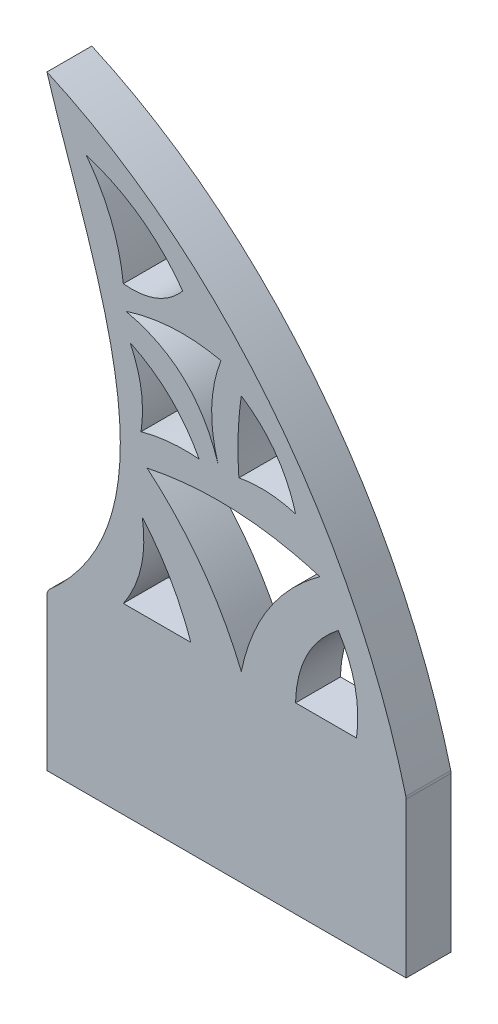
ISO-10303-21;
HEADER;
FILE_DESCRIPTION(('STEP AP214'),'2;1');
FILE_NAME('part.step','',(''),(''),'','','');
FILE_SCHEMA(('AUTOMOTIVE_DESIGN { 1 0 10303 214 1 1 1 1 }'));
ENDSEC;
DATA;
#1=APPLICATION_CONTEXT('core data for automotive mechanical design processes');
#2=APPLICATION_PROTOCOL_DEFINITION('international standard','automotive_design',2000,#1);
#3=PRODUCT_CONTEXT('',#1,'mechanical');
#4=PRODUCT('Part','Part','',(#3));
#5=PRODUCT_RELATED_PRODUCT_CATEGORY('part','',(#4));
#6=PRODUCT_DEFINITION_FORMATION('','',#4);
#7=PRODUCT_DEFINITION_CONTEXT('part definition',#1,'design');
#8=PRODUCT_DEFINITION('design','',#6,#7);
#9=PRODUCT_DEFINITION_SHAPE('','',#8);
#10=(LENGTH_UNIT() NAMED_UNIT(*) SI_UNIT(.MILLI.,.METRE.));
#11=(NAMED_UNIT(*) PLANE_ANGLE_UNIT() SI_UNIT($,.RADIAN.));
#12=(NAMED_UNIT(*) SI_UNIT($,.STERADIAN.) SOLID_ANGLE_UNIT());
#13=UNCERTAINTY_MEASURE_WITH_UNIT(LENGTH_MEASURE(1.E-05),#10,'distance_accuracy_value','');
#14=(GEOMETRIC_REPRESENTATION_CONTEXT(3) GLOBAL_UNCERTAINTY_ASSIGNED_CONTEXT((#13)) GLOBAL_UNIT_ASSIGNED_CONTEXT((#10,
#11,#12)) REPRESENTATION_CONTEXT('',''));
#15=CARTESIAN_POINT('',(0.,0.,0.));
#16=DIRECTION('',(0.,0.,1.));
#17=DIRECTION('',(1.,0.,0.));
#18=AXIS2_PLACEMENT_3D('',#15,#16,#17);
#19=CARTESIAN_POINT('',(0.,0.,12.7));
#20=DIRECTION('',(-1.,0.,0.));
#21=DIRECTION('',(0.,0.,1.));
#22=AXIS2_PLACEMENT_3D('',#19,#20,#21);
#23=PLANE('',#22);
#24=DIRECTION('',(0.,0.,1.));
#25=VECTOR('',#24,1.);
#26=CARTESIAN_POINT('',(0.,108.263964199217,0.));
#27=LINE('',#26,#25);
#28=CARTESIAN_POINT('',(0.,108.263964199217,0.));
#29=VERTEX_POINT('',#28);
#30=CARTESIAN_POINT('',(0.,108.263964199217,12.7));
#31=VERTEX_POINT('',#30);
#32=EDGE_CURVE('E63',#29,#31,#27,.T.);
#33=ORIENTED_EDGE('',*,*,#32,.T.);
#34=DIRECTION('',(0.,1.,0.));
#35=VECTOR('',#34,1.);
#36=CARTESIAN_POINT('',(0.,0.,12.7));
#37=LINE('',#36,#35);
#38=CARTESIAN_POINT('',(0.,151.251284081008,12.7));
#39=VERTEX_POINT('',#38);
#40=EDGE_CURVE('E70',#31,#39,#37,.T.);
#41=ORIENTED_EDGE('',*,*,#40,.T.);
#42=DIRECTION('',(0.,0.,-1.));
#43=VECTOR('',#42,1.);
#44=CARTESIAN_POINT('',(0.,151.251284081008,12.7));
#45=LINE('',#44,#43);
#46=CARTESIAN_POINT('',(0.,151.251284081008,0.));
#47=VERTEX_POINT('',#46);
#48=EDGE_CURVE('E56',#39,#47,#45,.T.);
#49=ORIENTED_EDGE('',*,*,#48,.T.);
#50=DIRECTION('',(0.,1.,0.));
#51=VECTOR('',#50,1.);
#52=CARTESIAN_POINT('',(0.,0.,0.));
#53=LINE('',#52,#51);
#54=EDGE_CURVE('E257',#29,#47,#53,.T.);
#55=ORIENTED_EDGE('',*,*,#54,.F.);
#56=EDGE_LOOP('',(#33,#41,#49,#55));
#57=FACE_BOUND('',#56,.T.);
#58=ADVANCED_FACE('F47',(#57),#23,.T.);
#59=CARTESIAN_POINT('',(101.6,0.,12.7));
#60=DIRECTION('',(-1.,0.,0.));
#61=DIRECTION('',(0.,0.,1.));
#62=AXIS2_PLACEMENT_3D('',#59,#60,#61);
#63=PLANE('',#62);
#64=DIRECTION('',(0.,1.,0.));
#65=VECTOR('',#64,1.);
#66=CARTESIAN_POINT('',(101.6,0.,12.7));
#67=LINE('',#66,#65);
#68=CARTESIAN_POINT('',(101.6,108.263964199217,12.7));
#69=VERTEX_POINT('',#68);
#70=CARTESIAN_POINT('',(101.6,152.077820816032,12.7));
#71=VERTEX_POINT('',#70);
#72=EDGE_CURVE('E247',#69,#71,#67,.T.);
#73=ORIENTED_EDGE('',*,*,#72,.F.);
#74=DIRECTION('',(0.,0.,1.));
#75=VECTOR('',#74,1.);
#76=CARTESIAN_POINT('',(101.6,108.263964199217,0.));
#77=LINE('',#76,#75);
#78=CARTESIAN_POINT('',(101.6,108.263964199217,0.));
#79=VERTEX_POINT('',#78);
#80=EDGE_CURVE('E233',#79,#69,#77,.T.);
#81=ORIENTED_EDGE('',*,*,#80,.F.);
#82=DIRECTION('',(0.,1.,0.));
#83=VECTOR('',#82,1.);
#84=CARTESIAN_POINT('',(101.6,0.,0.));
#85=LINE('',#84,#83);
#86=CARTESIAN_POINT('',(101.6,152.077820816032,0.));
#87=VERTEX_POINT('',#86);
#88=EDGE_CURVE('E245',#79,#87,#85,.T.);
#89=ORIENTED_EDGE('',*,*,#88,.T.);
#90=DIRECTION('',(0.,0.,1.));
#91=VECTOR('',#90,1.);
#92=CARTESIAN_POINT('',(101.6,152.077820816032,12.7));
#93=LINE('',#92,#91);
#94=EDGE_CURVE('E278',#87,#71,#93,.T.);
#95=ORIENTED_EDGE('',*,*,#94,.T.);
#96=EDGE_LOOP('',(#73,#81,#89,#95));
#97=FACE_BOUND('',#96,.T.);
#98=ADVANCED_FACE('F243',(#97),#63,.F.);
#99=CARTESIAN_POINT('',(0.,0.,12.7));
#100=DIRECTION('',(0.,0.,1.));
#101=DIRECTION('',(1.,0.,0.));
#102=AXIS2_PLACEMENT_3D('',#99,#100,#101);
#103=PLANE('',#102);
#104=DIRECTION('',(-1.,0.,0.));
#105=VECTOR('',#104,1.);
#106=CARTESIAN_POINT('',(101.519048921032,108.263964199217,12.7));
#107=LINE('',#106,#105);
#108=EDGE_CURVE('E239',#69,#31,#107,.T.);
#109=ORIENTED_EDGE('',*,*,#108,.F.);
#110=ORIENTED_EDGE('',*,*,#72,.T.);
#111=CARTESIAN_POINT('',(99.06,152.077820816032,12.7));
#112=DIRECTION('',(0.,0.,1.));
#113=DIRECTION('',(1.,0.,0.));
#114=AXIS2_PLACEMENT_3D('',#111,#112,#113);
#115=CIRCLE('',#114,2.54);
#116=CARTESIAN_POINT('',(101.519048921032,152.713964199217,12.7));
#117=VERTEX_POINT('',#116);
#118=EDGE_CURVE('E284',#71,#117,#115,.T.);
#119=ORIENTED_EDGE('',*,*,#118,.T.);
#120=CARTESIAN_POINT('',(0.,279.4,12.7));
#121=CARTESIAN_POINT('',(51.286050257495,256.550041835225,12.7));
#122=CARTESIAN_POINT('',(87.8368923823486,205.957944637487,12.7));
#123=CARTESIAN_POINT('',(101.6,152.4,12.7));
#124=B_SPLINE_CURVE_WITH_KNOTS('',3,(#120,#121,#122,#123),.UNSPECIFIED.,.F.,.F.,(4,4),(0.,1.),.UNSPECIFIED.);
#125=CARTESIAN_POINT('',(0.,279.4,12.7));
#126=VERTEX_POINT('',#125);
#127=EDGE_CURVE('E504',#126,#117,#124,.T.);
#128=ORIENTED_EDGE('',*,*,#127,.F.);
#129=CARTESIAN_POINT('',(0.,152.4,12.7));
#130=CARTESIAN_POINT('',(39.7901112765311,186.839065643264,12.7));
#131=CARTESIAN_POINT('',(12.3097562496038,238.845497072906,12.7));
#132=CARTESIAN_POINT('',(0.,279.4,12.7));
#133=B_SPLINE_CURVE_WITH_KNOTS('',3,(#129,#130,#131,#132),.UNSPECIFIED.,.F.,.F.,(4,4),(0.,1.),.UNSPECIFIED.);
#134=CARTESIAN_POINT('',(0.847696562527861,153.145408964832,12.7));
#135=VERTEX_POINT('',#134);
#136=EDGE_CURVE('E507',#135,#126,#133,.T.);
#137=ORIENTED_EDGE('',*,*,#136,.F.);
#138=CARTESIAN_POINT('',(2.54,151.251284081008,12.7));
#139=DIRECTION('',(0.,0.,1.));
#140=DIRECTION('',(1.,0.,0.));
#141=AXIS2_PLACEMENT_3D('',#138,#139,#140);
#142=CIRCLE('',#141,2.54);
#143=EDGE_CURVE('E281',#135,#39,#142,.T.);
#144=ORIENTED_EDGE('',*,*,#143,.T.);
#145=ORIENTED_EDGE('',*,*,#40,.F.);
#146=EDGE_LOOP('',(#109,#110,#119,#128,#137,#144,#145));
#147=FACE_BOUND('',#146,.T.);
#148=CARTESIAN_POINT('',(49.2258384870738,233.315766273676,12.7));
#149=CARTESIAN_POINT('',(35.6412289440212,236.267866948693,12.7));
#150=CARTESIAN_POINT('',(22.3756152670284,231.937259722309,12.7));
#151=B_SPLINE_CURVE_WITH_KNOTS('',2,(#148,#149,#150),.UNSPECIFIED.,.F.,.F.,(3,3),(0.,1.),.UNSPECIFIED.);
#152=CARTESIAN_POINT('',(49.2258384870738,233.315766273676,12.7));
#153=VERTEX_POINT('',#152);
#154=CARTESIAN_POINT('',(22.3756152670284,231.937259722309,12.7));
#155=VERTEX_POINT('',#154);
#156=EDGE_CURVE('E421',#153,#155,#151,.T.);
#157=ORIENTED_EDGE('',*,*,#156,.F.);
#158=CARTESIAN_POINT('',(48.4003507205885,207.535437600744,12.7));
#159=CARTESIAN_POINT('',(44.3935689433076,220.734513873405,12.7));
#160=CARTESIAN_POINT('',(49.2258384870738,233.315766273676,12.7));
#161=B_SPLINE_CURVE_WITH_KNOTS('',2,(#158,#159,#160),.UNSPECIFIED.,.F.,.F.,(3,3),(0.,1.),.UNSPECIFIED.);
#162=CARTESIAN_POINT('',(48.4003507205885,207.535437600744,12.7));
#163=VERTEX_POINT('',#162);
#164=EDGE_CURVE('E1028',#163,#153,#161,.T.);
#165=ORIENTED_EDGE('',*,*,#164,.F.);
#166=CARTESIAN_POINT('',(48.4003507205885,207.535437600744,12.7));
#167=CARTESIAN_POINT('',(42.0541709012612,227.566198030611,12.7));
#168=CARTESIAN_POINT('',(22.3756152670284,231.937259722309,12.7));
#169=B_SPLINE_CURVE_WITH_KNOTS('',2,(#166,#167,#168),.UNSPECIFIED.,.F.,.F.,(3,3),(0.,1.),.UNSPECIFIED.);
#170=EDGE_CURVE('E1022',#163,#155,#169,.T.);
#171=ORIENTED_EDGE('',*,*,#170,.T.);
#172=EDGE_LOOP('',(#157,#165,#171));
#173=FACE_BOUND('',#172,.T.);
#174=CARTESIAN_POINT('',(43.0534809797926,206.088034939823,12.7));
#175=CARTESIAN_POINT('',(36.2397899942018,218.912660539888,12.7));
#176=CARTESIAN_POINT('',(23.5160663721444,224.861937296205,12.7));
#177=B_SPLINE_CURVE_WITH_KNOTS('',2,(#174,#175,#176),.UNSPECIFIED.,.F.,.F.,(3,3),(0.,1.),.UNSPECIFIED.);
#178=CARTESIAN_POINT('',(43.0534809797926,206.088034939823,12.7));
#179=VERTEX_POINT('',#178);
#180=CARTESIAN_POINT('',(23.5160663721444,224.861937296205,12.7));
#181=VERTEX_POINT('',#180);
#182=EDGE_CURVE('E1027',#179,#181,#177,.T.);
#183=ORIENTED_EDGE('',*,*,#182,.F.);
#184=CARTESIAN_POINT('',(26.6057281170054,204.582177714214,12.7));
#185=CARTESIAN_POINT('',(34.7004326090841,206.792891753804,12.7));
#186=CARTESIAN_POINT('',(43.0534809797926,206.088034939823,12.7));
#187=B_SPLINE_CURVE_WITH_KNOTS('',2,(#184,#185,#186),.UNSPECIFIED.,.F.,.F.,(3,3),(0.,1.),.UNSPECIFIED.);
#188=CARTESIAN_POINT('',(26.6057281170054,204.582177714214,12.7));
#189=VERTEX_POINT('',#188);
#190=EDGE_CURVE('E1042',#189,#179,#187,.T.);
#191=ORIENTED_EDGE('',*,*,#190,.F.);
#192=CARTESIAN_POINT('',(23.5160663721444,224.861937296205,12.7));
#193=CARTESIAN_POINT('',(28.2352954071151,215.219272619894,12.7));
#194=CARTESIAN_POINT('',(26.6057281170054,204.582177714214,12.7));
#195=B_SPLINE_CURVE_WITH_KNOTS('',2,(#192,#193,#194),.UNSPECIFIED.,.F.,.F.,(3,3),(0.,1.),.UNSPECIFIED.);
#196=EDGE_CURVE('E1051',#181,#189,#195,.T.);
#197=ORIENTED_EDGE('',*,*,#196,.F.);
#198=EDGE_LOOP('',(#183,#191,#197));
#199=FACE_BOUND('',#198,.T.);
#200=CARTESIAN_POINT('',(82.3960896551855,183.8137177803,12.7));
#201=CARTESIAN_POINT('',(70.6713648996861,174.663598783607,12.7));
#202=CARTESIAN_POINT('',(70.3277731701593,160.02,12.7));
#203=B_SPLINE_CURVE_WITH_KNOTS('',2,(#200,#201,#202),.UNSPECIFIED.,.F.,.F.,(3,3),(0.,1.),.UNSPECIFIED.);
#204=CARTESIAN_POINT('',(82.3960896551855,183.8137177803,12.7));
#205=VERTEX_POINT('',#204);
#206=CARTESIAN_POINT('',(70.3277731701593,160.02,12.7));
#207=VERTEX_POINT('',#206);
#208=EDGE_CURVE('E559',#205,#207,#203,.T.);
#209=ORIENTED_EDGE('',*,*,#208,.F.);
#210=CARTESIAN_POINT('',(82.3960896551855,183.8137177803,12.7));
#211=CARTESIAN_POINT('',(89.3395503674179,172.773814042826,12.7));
#212=CARTESIAN_POINT('',(87.546521436446,160.02,12.7));
#213=B_SPLINE_CURVE_WITH_KNOTS('',2,(#210,#211,#212),.UNSPECIFIED.,.F.,.F.,(3,3),(0.,1.),.UNSPECIFIED.);
#214=CARTESIAN_POINT('',(87.546521436446,160.02,12.7));
#215=VERTEX_POINT('',#214);
#216=EDGE_CURVE('E554',#205,#215,#213,.T.);
#217=ORIENTED_EDGE('',*,*,#216,.T.);
#218=DIRECTION('',(1.,0.,0.));
#219=VECTOR('',#218,1.);
#220=CARTESIAN_POINT('',(0.,160.02,12.7));
#221=LINE('',#220,#219);
#222=EDGE_CURVE('E514',#207,#215,#221,.T.);
#223=ORIENTED_EDGE('',*,*,#222,.F.);
#224=EDGE_LOOP('',(#209,#217,#223));
#225=FACE_BOUND('',#224,.T.);
#226=CARTESIAN_POINT('',(26.9804663757679,183.813742110307,12.7));
#227=CARTESIAN_POINT('',(28.9587756049128,170.83754360767,12.7));
#228=CARTESIAN_POINT('',(21.602944742717,160.02,12.7));
#229=B_SPLINE_CURVE_WITH_KNOTS('',2,(#226,#227,#228),.UNSPECIFIED.,.F.,.F.,(3,3),(0.,1.),.UNSPECIFIED.);
#230=CARTESIAN_POINT('',(26.9804663757679,183.813742110307,12.7));
#231=VERTEX_POINT('',#230);
#232=CARTESIAN_POINT('',(21.602944742717,160.02,12.7));
#233=VERTEX_POINT('',#232);
#234=EDGE_CURVE('E506',#231,#233,#229,.T.);
#235=ORIENTED_EDGE('',*,*,#234,.F.);
#236=CARTESIAN_POINT('',(26.9804663757679,183.813742110307,12.7));
#237=CARTESIAN_POINT('',(36.1384728498924,173.175056715144,12.7));
#238=CARTESIAN_POINT('',(40.6766417755855,160.02,12.7));
#239=B_SPLINE_CURVE_WITH_KNOTS('',2,(#236,#237,#238),.UNSPECIFIED.,.F.,.F.,(3,3),(0.,1.),.UNSPECIFIED.);
#240=CARTESIAN_POINT('',(40.6766417755855,160.02,12.7));
#241=VERTEX_POINT('',#240);
#242=EDGE_CURVE('E512',#231,#241,#239,.T.);
#243=ORIENTED_EDGE('',*,*,#242,.T.);
#244=DIRECTION('',(-1.,0.,0.));
#245=VECTOR('',#244,1.);
#246=CARTESIAN_POINT('',(0.,160.02,12.7));
#247=LINE('',#246,#245);
#248=EDGE_CURVE('E757',#241,#233,#247,.T.);
#249=ORIENTED_EDGE('',*,*,#248,.T.);
#250=EDGE_LOOP('',(#235,#243,#249));
#251=FACE_BOUND('',#250,.T.);
#252=CARTESIAN_POINT('',(54.9770830803954,160.02,12.7));
#253=CARTESIAN_POINT('',(46.0834758399413,181.547553160455,12.7));
#254=CARTESIAN_POINT('',(28.3421369029203,196.52980248231,12.7));
#255=B_SPLINE_CURVE_WITH_KNOTS('',2,(#252,#253,#254),.UNSPECIFIED.,.F.,.F.,(3,3),(0.,1.),.UNSPECIFIED.);
#256=CARTESIAN_POINT('',(54.9770830803954,160.02,12.7));
#257=VERTEX_POINT('',#256);
#258=CARTESIAN_POINT('',(28.3421369029203,196.52980248231,12.7));
#259=VERTEX_POINT('',#258);
#260=EDGE_CURVE('E747',#257,#259,#255,.T.);
#261=ORIENTED_EDGE('',*,*,#260,.T.);
#262=CARTESIAN_POINT('',(28.3421369029203,196.52980248231,12.7));
#263=CARTESIAN_POINT('',(53.0178150021792,201.732288520624,12.7));
#264=CARTESIAN_POINT('',(77.1872044953657,194.363538627742,12.7));
#265=B_SPLINE_CURVE_WITH_KNOTS('',2,(#262,#263,#264),.UNSPECIFIED.,.F.,.F.,(3,3),(0.,1.),.UNSPECIFIED.);
#266=CARTESIAN_POINT('',(77.1872044953657,194.363538627742,12.7));
#267=VERTEX_POINT('',#266);
#268=EDGE_CURVE('E738',#259,#267,#265,.T.);
#269=ORIENTED_EDGE('',*,*,#268,.T.);
#270=CARTESIAN_POINT('',(54.9770830803954,160.02,12.7));
#271=CARTESIAN_POINT('',(59.3747288950181,181.400643158016,12.7));
#272=CARTESIAN_POINT('',(77.1872044953657,194.363538627742,12.7));
#273=B_SPLINE_CURVE_WITH_KNOTS('',2,(#270,#271,#272),.UNSPECIFIED.,.F.,.F.,(3,3),(0.,1.),.UNSPECIFIED.);
#274=EDGE_CURVE('E732',#257,#267,#273,.T.);
#275=ORIENTED_EDGE('',*,*,#274,.F.);
#276=EDGE_LOOP('',(#261,#269,#275));
#277=FACE_BOUND('',#276,.T.);
#278=CARTESIAN_POINT('',(70.3282595613759,206.27745757837,12.7));
#279=CARTESIAN_POINT('',(62.3615769619994,208.669014940846,12.7));
#280=CARTESIAN_POINT('',(54.287141361752,207.109917469007,12.7));
#281=B_SPLINE_CURVE_WITH_KNOTS('',2,(#278,#279,#280),.UNSPECIFIED.,.F.,.F.,(3,3),(0.,1.),.UNSPECIFIED.);
#282=CARTESIAN_POINT('',(70.3282595613759,206.27745757837,12.7));
#283=VERTEX_POINT('',#282);
#284=CARTESIAN_POINT('',(54.287141361752,207.109917469007,12.7));
#285=VERTEX_POINT('',#284);
#286=EDGE_CURVE('E709',#283,#285,#281,.T.);
#287=ORIENTED_EDGE('',*,*,#286,.T.);
#288=CARTESIAN_POINT('',(54.287141361752,207.109917469007,12.7));
#289=CARTESIAN_POINT('',(53.4820968113887,217.391663166995,12.7));
#290=CARTESIAN_POINT('',(54.9770830803954,227.557269011986,12.7));
#291=B_SPLINE_CURVE_WITH_KNOTS('',2,(#288,#289,#290),.UNSPECIFIED.,.F.,.F.,(3,3),(0.,1.),.UNSPECIFIED.);
#292=CARTESIAN_POINT('',(54.9770830803954,227.557269011986,12.7));
#293=VERTEX_POINT('',#292);
#294=EDGE_CURVE('E700',#285,#293,#291,.T.);
#295=ORIENTED_EDGE('',*,*,#294,.T.);
#296=CARTESIAN_POINT('',(54.9770830803954,227.557269011986,12.7));
#297=CARTESIAN_POINT('',(66.6458597542174,219.852180833507,12.7));
#298=CARTESIAN_POINT('',(70.3282595613759,206.27745757837,12.7));
#299=B_SPLINE_CURVE_WITH_KNOTS('',2,(#296,#297,#298),.UNSPECIFIED.,.F.,.F.,(3,3),(0.,1.),.UNSPECIFIED.);
#300=EDGE_CURVE('E691',#293,#283,#299,.T.);
#301=ORIENTED_EDGE('',*,*,#300,.T.);
#302=EDGE_LOOP('',(#287,#295,#301));
#303=FACE_BOUND('',#302,.T.);
#304=CARTESIAN_POINT('',(21.602944742717,238.323137826184,12.7));
#305=CARTESIAN_POINT('',(19.9519756703058,252.974545224531,12.7));
#306=CARTESIAN_POINT('',(11.0947377675254,264.601494060694,12.7));
#307=B_SPLINE_CURVE_WITH_KNOTS('',2,(#304,#305,#306),.UNSPECIFIED.,.F.,.F.,(3,3),(0.,1.),.UNSPECIFIED.);
#308=CARTESIAN_POINT('',(21.602944742717,238.323137826184,12.7));
#309=VERTEX_POINT('',#308);
#310=CARTESIAN_POINT('',(11.0947377675254,264.601494060694,12.7));
#311=VERTEX_POINT('',#310);
#312=EDGE_CURVE('E685',#309,#311,#307,.T.);
#313=ORIENTED_EDGE('',*,*,#312,.T.);
#314=CARTESIAN_POINT('',(11.0947377675254,264.601494060694,12.7));
#315=CARTESIAN_POINT('',(28.0538351864922,259.295838114787,12.7));
#316=CARTESIAN_POINT('',(38.4122672823243,244.949944055659,12.7));
#317=B_SPLINE_CURVE_WITH_KNOTS('',2,(#314,#315,#316),.UNSPECIFIED.,.F.,.F.,(3,3),(0.,1.),.UNSPECIFIED.);
#318=CARTESIAN_POINT('',(38.4122672823243,244.949944055659,12.7));
#319=VERTEX_POINT('',#318);
#320=EDGE_CURVE('E658',#311,#319,#317,.T.);
#321=ORIENTED_EDGE('',*,*,#320,.T.);
#322=CARTESIAN_POINT('',(21.602944742717,238.323137826184,12.7));
#323=CARTESIAN_POINT('',(31.864782778685,237.284469605231,12.7));
#324=CARTESIAN_POINT('',(38.4122672823243,244.949944055659,12.7));
#325=B_SPLINE_CURVE_WITH_KNOTS('',2,(#322,#323,#324),.UNSPECIFIED.,.F.,.F.,(3,3),(0.,1.),.UNSPECIFIED.);
#326=EDGE_CURVE('E487',#309,#319,#325,.T.);
#327=ORIENTED_EDGE('',*,*,#326,.F.);
#328=EDGE_LOOP('',(#313,#321,#327));
#329=FACE_BOUND('',#328,.T.);
#330=ADVANCED_FACE('F494',(#147,#173,#199,#225,#251,#277,#303,#329),#103,.T.);
#331=CARTESIAN_POINT('',(0.,0.,0.));
#332=DIRECTION('',(0.,0.,1.));
#333=DIRECTION('',(1.,0.,0.));
#334=AXIS2_PLACEMENT_3D('',#331,#332,#333);
#335=PLANE('',#334);
#336=ORIENTED_EDGE('',*,*,#88,.F.);
#337=DIRECTION('',(-1.,0.,0.));
#338=VECTOR('',#337,1.);
#339=CARTESIAN_POINT('',(101.519048921032,108.263964199217,0.));
#340=LINE('',#339,#338);
#341=EDGE_CURVE('E230',#79,#29,#340,.T.);
#342=ORIENTED_EDGE('',*,*,#341,.T.);
#343=ORIENTED_EDGE('',*,*,#54,.T.);
#344=CARTESIAN_POINT('',(2.54,151.251284081008,0.));
#345=DIRECTION('',(0.,0.,1.));
#346=DIRECTION('',(1.,0.,0.));
#347=AXIS2_PLACEMENT_3D('',#344,#345,#346);
#348=CIRCLE('',#347,2.54);
#349=CARTESIAN_POINT('',(0.847696562527882,153.145408964832,0.));
#350=VERTEX_POINT('',#349);
#351=EDGE_CURVE('E273',#47,#350,#348,.F.);
#352=ORIENTED_EDGE('',*,*,#351,.T.);
#353=CARTESIAN_POINT('',(0.,152.4,0.));
#354=CARTESIAN_POINT('',(39.7901112765311,186.839065643264,0.));
#355=CARTESIAN_POINT('',(12.3097562496038,238.845497072906,0.));
#356=CARTESIAN_POINT('',(0.,279.4,0.));
#357=B_SPLINE_CURVE_WITH_KNOTS('',3,(#353,#354,#355,#356),.UNSPECIFIED.,.F.,.F.,(4,4),(0.,1.),.UNSPECIFIED.);
#358=CARTESIAN_POINT('',(0.,279.4,0.));
#359=VERTEX_POINT('',#358);
#360=EDGE_CURVE('E293',#350,#359,#357,.T.);
#361=ORIENTED_EDGE('',*,*,#360,.T.);
#362=CARTESIAN_POINT('',(0.,279.4,0.));
#363=CARTESIAN_POINT('',(51.286050257495,256.550041835225,0.));
#364=CARTESIAN_POINT('',(87.8368923823486,205.957944637487,0.));
#365=CARTESIAN_POINT('',(101.6,152.4,0.));
#366=B_SPLINE_CURVE_WITH_KNOTS('',3,(#362,#363,#364,#365),.UNSPECIFIED.,.F.,.F.,(4,4),(0.,1.),.UNSPECIFIED.);
#367=CARTESIAN_POINT('',(101.519048921032,152.713964199217,0.));
#368=VERTEX_POINT('',#367);
#369=EDGE_CURVE('E302',#359,#368,#366,.T.);
#370=ORIENTED_EDGE('',*,*,#369,.T.);
#371=CARTESIAN_POINT('',(99.06,152.077820816032,0.));
#372=DIRECTION('',(0.,0.,1.));
#373=DIRECTION('',(1.,0.,0.));
#374=AXIS2_PLACEMENT_3D('',#371,#372,#373);
#375=CIRCLE('',#374,2.54);
#376=EDGE_CURVE('E254',#368,#87,#375,.F.);
#377=ORIENTED_EDGE('',*,*,#376,.T.);
#378=EDGE_LOOP('',(#336,#342,#343,#352,#361,#370,#377));
#379=FACE_BOUND('',#378,.T.);
#380=CARTESIAN_POINT('',(49.2258384870738,233.315766273676,0.));
#381=CARTESIAN_POINT('',(35.6412289440212,236.267866948693,0.));
#382=CARTESIAN_POINT('',(22.3756152670284,231.937259722309,0.));
#383=B_SPLINE_CURVE_WITH_KNOTS('',2,(#380,#381,#382),.UNSPECIFIED.,.F.,.F.,(3,3),(0.,1.),.UNSPECIFIED.);
#384=CARTESIAN_POINT('',(49.2258384870738,233.315766273676,0.));
#385=VERTEX_POINT('',#384);
#386=CARTESIAN_POINT('',(22.3756152670284,231.937259722309,0.));
#387=VERTEX_POINT('',#386);
#388=EDGE_CURVE('E249',#385,#387,#383,.T.);
#389=ORIENTED_EDGE('',*,*,#388,.T.);
#390=CARTESIAN_POINT('',(48.4003507205885,207.535437600744,0.));
#391=CARTESIAN_POINT('',(42.0541709012612,227.566198030611,0.));
#392=CARTESIAN_POINT('',(22.3756152670284,231.937259722309,0.));
#393=B_SPLINE_CURVE_WITH_KNOTS('',2,(#390,#391,#392),.UNSPECIFIED.,.F.,.F.,(3,3),(0.,1.),.UNSPECIFIED.);
#394=CARTESIAN_POINT('',(48.4003507205885,207.535437600744,0.));
#395=VERTEX_POINT('',#394);
#396=EDGE_CURVE('E623',#395,#387,#393,.T.);
#397=ORIENTED_EDGE('',*,*,#396,.F.);
#398=CARTESIAN_POINT('',(48.4003507205885,207.535437600744,0.));
#399=CARTESIAN_POINT('',(44.3935689433076,220.734513873405,0.));
#400=CARTESIAN_POINT('',(49.2258384870738,233.315766273676,0.));
#401=B_SPLINE_CURVE_WITH_KNOTS('',2,(#398,#399,#400),.UNSPECIFIED.,.F.,.F.,(3,3),(0.,1.),.UNSPECIFIED.);
#402=EDGE_CURVE('E632',#395,#385,#401,.T.);
#403=ORIENTED_EDGE('',*,*,#402,.T.);
#404=EDGE_LOOP('',(#389,#397,#403));
#405=FACE_BOUND('',#404,.T.);
#406=CARTESIAN_POINT('',(43.0534809797926,206.088034939823,0.));
#407=CARTESIAN_POINT('',(36.2397899942018,218.912660539888,0.));
#408=CARTESIAN_POINT('',(23.5160663721444,224.861937296205,0.));
#409=B_SPLINE_CURVE_WITH_KNOTS('',2,(#406,#407,#408),.UNSPECIFIED.,.F.,.F.,(3,3),(0.,1.),.UNSPECIFIED.);
#410=CARTESIAN_POINT('',(43.0534809797926,206.088034939823,0.));
#411=VERTEX_POINT('',#410);
#412=CARTESIAN_POINT('',(23.5160663721444,224.861937296205,0.));
#413=VERTEX_POINT('',#412);
#414=EDGE_CURVE('E614',#411,#413,#409,.T.);
#415=ORIENTED_EDGE('',*,*,#414,.T.);
#416=CARTESIAN_POINT('',(23.5160663721444,224.861937296205,0.));
#417=CARTESIAN_POINT('',(28.2352954071151,215.219272619894,0.));
#418=CARTESIAN_POINT('',(26.6057281170054,204.582177714214,0.));
#419=B_SPLINE_CURVE_WITH_KNOTS('',2,(#416,#417,#418),.UNSPECIFIED.,.F.,.F.,(3,3),(0.,1.),.UNSPECIFIED.);
#420=CARTESIAN_POINT('',(26.6057281170054,204.582177714214,0.));
#421=VERTEX_POINT('',#420);
#422=EDGE_CURVE('E587',#413,#421,#419,.T.);
#423=ORIENTED_EDGE('',*,*,#422,.T.);
#424=CARTESIAN_POINT('',(26.6057281170054,204.582177714214,0.));
#425=CARTESIAN_POINT('',(34.7004326090841,206.792891753804,0.));
#426=CARTESIAN_POINT('',(43.0534809797926,206.088034939823,0.));
#427=B_SPLINE_CURVE_WITH_KNOTS('',2,(#424,#425,#426),.UNSPECIFIED.,.F.,.F.,(3,3),(0.,1.),.UNSPECIFIED.);
#428=EDGE_CURVE('E591',#421,#411,#427,.T.);
#429=ORIENTED_EDGE('',*,*,#428,.T.);
#430=EDGE_LOOP('',(#415,#423,#429));
#431=FACE_BOUND('',#430,.T.);
#432=CARTESIAN_POINT('',(82.3960896551855,183.8137177803,0.));
#433=CARTESIAN_POINT('',(70.6713648996861,174.663598783607,0.));
#434=CARTESIAN_POINT('',(70.3277731701593,160.02,0.));
#435=B_SPLINE_CURVE_WITH_KNOTS('',2,(#432,#433,#434),.UNSPECIFIED.,.F.,.F.,(3,3),(0.,1.),.UNSPECIFIED.);
#436=CARTESIAN_POINT('',(82.3960896551855,183.8137177803,0.));
#437=VERTEX_POINT('',#436);
#438=CARTESIAN_POINT('',(70.3277731701593,160.02,0.));
#439=VERTEX_POINT('',#438);
#440=EDGE_CURVE('E583',#437,#439,#435,.T.);
#441=ORIENTED_EDGE('',*,*,#440,.T.);
#442=DIRECTION('',(1.,0.,0.));
#443=VECTOR('',#442,1.);
#444=CARTESIAN_POINT('',(0.,160.02,0.));
#445=LINE('',#444,#443);
#446=CARTESIAN_POINT('',(87.546521436446,160.02,0.));
#447=VERTEX_POINT('',#446);
#448=EDGE_CURVE('E303',#439,#447,#445,.T.);
#449=ORIENTED_EDGE('',*,*,#448,.T.);
#450=CARTESIAN_POINT('',(82.3960896551855,183.8137177803,0.));
#451=CARTESIAN_POINT('',(89.3395503674179,172.773814042826,0.));
#452=CARTESIAN_POINT('',(87.546521436446,160.02,0.));
#453=B_SPLINE_CURVE_WITH_KNOTS('',2,(#450,#451,#452),.UNSPECIFIED.,.F.,.F.,(3,3),(0.,1.),.UNSPECIFIED.);
#454=EDGE_CURVE('E310',#437,#447,#453,.T.);
#455=ORIENTED_EDGE('',*,*,#454,.F.);
#456=EDGE_LOOP('',(#441,#449,#455));
#457=FACE_BOUND('',#456,.T.);
#458=CARTESIAN_POINT('',(26.9804663757679,183.813742110307,0.));
#459=CARTESIAN_POINT('',(28.9587756049128,170.83754360767,0.));
#460=CARTESIAN_POINT('',(21.602944742717,160.02,0.));
#461=B_SPLINE_CURVE_WITH_KNOTS('',2,(#458,#459,#460),.UNSPECIFIED.,.F.,.F.,(3,3),(0.,1.),.UNSPECIFIED.);
#462=CARTESIAN_POINT('',(26.9804663757679,183.813742110307,0.));
#463=VERTEX_POINT('',#462);
#464=CARTESIAN_POINT('',(21.602944742717,160.02,0.));
#465=VERTEX_POINT('',#464);
#466=EDGE_CURVE('E307',#463,#465,#461,.T.);
#467=ORIENTED_EDGE('',*,*,#466,.T.);
#468=DIRECTION('',(-1.,0.,0.));
#469=VECTOR('',#468,1.);
#470=CARTESIAN_POINT('',(0.,160.02,0.));
#471=LINE('',#470,#469);
#472=CARTESIAN_POINT('',(40.6766417755855,160.02,0.));
#473=VERTEX_POINT('',#472);
#474=EDGE_CURVE('E338',#473,#465,#471,.T.);
#475=ORIENTED_EDGE('',*,*,#474,.F.);
#476=CARTESIAN_POINT('',(26.9804663757679,183.813742110307,0.));
#477=CARTESIAN_POINT('',(36.1384728498924,173.175056715144,0.));
#478=CARTESIAN_POINT('',(40.6766417755855,160.02,0.));
#479=B_SPLINE_CURVE_WITH_KNOTS('',2,(#476,#477,#478),.UNSPECIFIED.,.F.,.F.,(3,3),(0.,1.),.UNSPECIFIED.);
#480=EDGE_CURVE('E329',#463,#473,#479,.T.);
#481=ORIENTED_EDGE('',*,*,#480,.F.);
#482=EDGE_LOOP('',(#467,#475,#481));
#483=FACE_BOUND('',#482,.T.);
#484=CARTESIAN_POINT('',(54.9770830803954,160.02,0.));
#485=CARTESIAN_POINT('',(46.0834758399413,181.547553160455,0.));
#486=CARTESIAN_POINT('',(28.3421369029203,196.52980248231,0.));
#487=B_SPLINE_CURVE_WITH_KNOTS('',2,(#484,#485,#486),.UNSPECIFIED.,.F.,.F.,(3,3),(0.,1.),.UNSPECIFIED.);
#488=CARTESIAN_POINT('',(54.9770830803954,160.02,0.));
#489=VERTEX_POINT('',#488);
#490=CARTESIAN_POINT('',(28.3421369029203,196.52980248231,0.));
#491=VERTEX_POINT('',#490);
#492=EDGE_CURVE('E345',#489,#491,#487,.T.);
#493=ORIENTED_EDGE('',*,*,#492,.F.);
#494=CARTESIAN_POINT('',(54.9770830803954,160.02,0.));
#495=CARTESIAN_POINT('',(59.3747288950181,181.400643158016,0.));
#496=CARTESIAN_POINT('',(77.1872044953657,194.363538627742,0.));
#497=B_SPLINE_CURVE_WITH_KNOTS('',2,(#494,#495,#496),.UNSPECIFIED.,.F.,.F.,(3,3),(0.,1.),.UNSPECIFIED.);
#498=CARTESIAN_POINT('',(77.1872044953657,194.363538627742,0.));
#499=VERTEX_POINT('',#498);
#500=EDGE_CURVE('E360',#489,#499,#497,.T.);
#501=ORIENTED_EDGE('',*,*,#500,.T.);
#502=CARTESIAN_POINT('',(28.3421369029203,196.52980248231,0.));
#503=CARTESIAN_POINT('',(53.0178150021792,201.732288520624,0.));
#504=CARTESIAN_POINT('',(77.1872044953657,194.363538627742,0.));
#505=B_SPLINE_CURVE_WITH_KNOTS('',2,(#502,#503,#504),.UNSPECIFIED.,.F.,.F.,(3,3),(0.,1.),.UNSPECIFIED.);
#506=EDGE_CURVE('E351',#491,#499,#505,.T.);
#507=ORIENTED_EDGE('',*,*,#506,.F.);
#508=EDGE_LOOP('',(#493,#501,#507));
#509=FACE_BOUND('',#508,.T.);
#510=CARTESIAN_POINT('',(70.3282595613759,206.27745757837,0.));
#511=CARTESIAN_POINT('',(62.3615769619994,208.669014940846,0.));
#512=CARTESIAN_POINT('',(54.287141361752,207.109917469007,0.));
#513=B_SPLINE_CURVE_WITH_KNOTS('',2,(#510,#511,#512),.UNSPECIFIED.,.F.,.F.,(3,3),(0.,1.),.UNSPECIFIED.);
#514=CARTESIAN_POINT('',(70.3282595613759,206.27745757837,0.));
#515=VERTEX_POINT('',#514);
#516=CARTESIAN_POINT('',(54.287141361752,207.109917469007,0.));
#517=VERTEX_POINT('',#516);
#518=EDGE_CURVE('E369',#515,#517,#513,.T.);
#519=ORIENTED_EDGE('',*,*,#518,.F.);
#520=CARTESIAN_POINT('',(54.9770830803954,227.557269011986,0.));
#521=CARTESIAN_POINT('',(66.6458597542174,219.852180833507,0.));
#522=CARTESIAN_POINT('',(70.3282595613759,206.27745757837,0.));
#523=B_SPLINE_CURVE_WITH_KNOTS('',2,(#520,#521,#522),.UNSPECIFIED.,.F.,.F.,(3,3),(0.,1.),.UNSPECIFIED.);
#524=CARTESIAN_POINT('',(54.9770830803954,227.557269011986,0.));
#525=VERTEX_POINT('',#524);
#526=EDGE_CURVE('E386',#525,#515,#523,.T.);
#527=ORIENTED_EDGE('',*,*,#526,.F.);
#528=CARTESIAN_POINT('',(54.287141361752,207.109917469007,0.));
#529=CARTESIAN_POINT('',(53.4820968113887,217.391663166995,0.));
#530=CARTESIAN_POINT('',(54.9770830803954,227.557269011986,0.));
#531=B_SPLINE_CURVE_WITH_KNOTS('',2,(#528,#529,#530),.UNSPECIFIED.,.F.,.F.,(3,3),(0.,1.),.UNSPECIFIED.);
#532=EDGE_CURVE('E378',#517,#525,#531,.T.);
#533=ORIENTED_EDGE('',*,*,#532,.F.);
#534=EDGE_LOOP('',(#519,#527,#533));
#535=FACE_BOUND('',#534,.T.);
#536=CARTESIAN_POINT('',(21.602944742717,238.323137826184,0.));
#537=CARTESIAN_POINT('',(19.9519756703058,252.974545224531,0.));
#538=CARTESIAN_POINT('',(11.0947377675254,264.601494060694,0.));
#539=B_SPLINE_CURVE_WITH_KNOTS('',2,(#536,#537,#538),.UNSPECIFIED.,.F.,.F.,(3,3),(0.,1.),.UNSPECIFIED.);
#540=CARTESIAN_POINT('',(21.602944742717,238.323137826184,0.));
#541=VERTEX_POINT('',#540);
#542=CARTESIAN_POINT('',(11.0947377675254,264.601494060694,0.));
#543=VERTEX_POINT('',#542);
#544=EDGE_CURVE('E394',#541,#543,#539,.T.);
#545=ORIENTED_EDGE('',*,*,#544,.F.);
#546=CARTESIAN_POINT('',(21.602944742717,238.323137826184,0.));
#547=CARTESIAN_POINT('',(31.864782778685,237.284469605231,0.));
#548=CARTESIAN_POINT('',(38.4122672823243,244.949944055659,0.));
#549=B_SPLINE_CURVE_WITH_KNOTS('',2,(#546,#547,#548),.UNSPECIFIED.,.F.,.F.,(3,3),(0.,1.),.UNSPECIFIED.);
#550=CARTESIAN_POINT('',(38.4122672823243,244.949944055659,0.));
#551=VERTEX_POINT('',#550);
#552=EDGE_CURVE('E412',#541,#551,#549,.T.);
#553=ORIENTED_EDGE('',*,*,#552,.T.);
#554=CARTESIAN_POINT('',(11.0947377675254,264.601494060694,0.));
#555=CARTESIAN_POINT('',(28.0538351864922,259.295838114787,0.));
#556=CARTESIAN_POINT('',(38.4122672823243,244.949944055659,0.));
#557=B_SPLINE_CURVE_WITH_KNOTS('',2,(#554,#555,#556),.UNSPECIFIED.,.F.,.F.,(3,3),(0.,1.),.UNSPECIFIED.);
#558=EDGE_CURVE('E403',#543,#551,#557,.T.);
#559=ORIENTED_EDGE('',*,*,#558,.F.);
#560=EDGE_LOOP('',(#545,#553,#559));
#561=FACE_BOUND('',#560,.T.);
#562=ADVANCED_FACE('F251',(#379,#405,#431,#457,#483,#509,#535,#561),#335,.F.);
#563=DIRECTION('',(0.,0.,-1.));
#564=VECTOR('',#563,1.);
#565=SURFACE_OF_LINEAR_EXTRUSION('',#307,#564);
#566=ORIENTED_EDGE('',*,*,#544,.T.);
#567=DIRECTION('',(0.,0.,-1.));
#568=VECTOR('',#567,1.);
#569=CARTESIAN_POINT('',(11.0947377675254,264.601494060694,12.7));
#570=LINE('',#569,#568);
#571=EDGE_CURVE('E258',#311,#543,#570,.T.);
#572=ORIENTED_EDGE('',*,*,#571,.F.);
#573=ORIENTED_EDGE('',*,*,#312,.F.);
#574=DIRECTION('',(0.,0.,-1.));
#575=VECTOR('',#574,1.);
#576=CARTESIAN_POINT('',(21.602944742717,238.323137826184,12.7));
#577=LINE('',#576,#575);
#578=EDGE_CURVE('E422',#309,#541,#577,.T.);
#579=ORIENTED_EDGE('',*,*,#578,.T.);
#580=EDGE_LOOP('',(#566,#572,#573,#579));
#581=FACE_BOUND('',#580,.T.);
#582=ADVANCED_FACE('F677',(#581),#565,.F.);
#583=DIRECTION('',(0.,0.,-1.));
#584=VECTOR('',#583,1.);
#585=SURFACE_OF_LINEAR_EXTRUSION('',#317,#584);
#586=ORIENTED_EDGE('',*,*,#558,.T.);
#587=DIRECTION('',(0.,0.,-1.));
#588=VECTOR('',#587,1.);
#589=CARTESIAN_POINT('',(38.4122672823243,244.949944055659,12.7));
#590=LINE('',#589,#588);
#591=EDGE_CURVE('E264',#319,#551,#590,.T.);
#592=ORIENTED_EDGE('',*,*,#591,.F.);
#593=ORIENTED_EDGE('',*,*,#320,.F.);
#594=ORIENTED_EDGE('',*,*,#571,.T.);
#595=EDGE_LOOP('',(#586,#592,#593,#594));
#596=FACE_BOUND('',#595,.T.);
#597=ADVANCED_FACE('F673',(#596),#585,.F.);
#598=DIRECTION('',(0.,0.,-1.));
#599=VECTOR('',#598,1.);
#600=SURFACE_OF_LINEAR_EXTRUSION('',#281,#599);
#601=ORIENTED_EDGE('',*,*,#518,.T.);
#602=DIRECTION('',(0.,0.,-1.));
#603=VECTOR('',#602,1.);
#604=CARTESIAN_POINT('',(54.287141361752,207.109917469007,12.7));
#605=LINE('',#604,#603);
#606=EDGE_CURVE('E428',#285,#517,#605,.T.);
#607=ORIENTED_EDGE('',*,*,#606,.F.);
#608=ORIENTED_EDGE('',*,*,#286,.F.);
#609=DIRECTION('',(0.,0.,-1.));
#610=VECTOR('',#609,1.);
#611=CARTESIAN_POINT('',(70.3282595613759,206.27745757837,12.7));
#612=LINE('',#611,#610);
#613=EDGE_CURVE('E431',#283,#515,#612,.T.);
#614=ORIENTED_EDGE('',*,*,#613,.T.);
#615=EDGE_LOOP('',(#601,#607,#608,#614));
#616=FACE_BOUND('',#615,.T.);
#617=ADVANCED_FACE('F676',(#616),#600,.F.);
#618=DIRECTION('',(0.,0.,-1.));
#619=VECTOR('',#618,1.);
#620=SURFACE_OF_LINEAR_EXTRUSION('',#291,#619);
#621=ORIENTED_EDGE('',*,*,#532,.T.);
#622=DIRECTION('',(0.,0.,-1.));
#623=VECTOR('',#622,1.);
#624=CARTESIAN_POINT('',(54.9770830803954,227.557269011986,12.7));
#625=LINE('',#624,#623);
#626=EDGE_CURVE('E435',#293,#525,#625,.T.);
#627=ORIENTED_EDGE('',*,*,#626,.F.);
#628=ORIENTED_EDGE('',*,*,#294,.F.);
#629=ORIENTED_EDGE('',*,*,#606,.T.);
#630=EDGE_LOOP('',(#621,#627,#628,#629));
#631=FACE_BOUND('',#630,.T.);
#632=ADVANCED_FACE('F717',(#631),#620,.F.);
#633=DIRECTION('',(0.,0.,-1.));
#634=VECTOR('',#633,1.);
#635=SURFACE_OF_LINEAR_EXTRUSION('',#255,#634);
#636=ORIENTED_EDGE('',*,*,#492,.T.);
#637=DIRECTION('',(0.,0.,-1.));
#638=VECTOR('',#637,1.);
#639=CARTESIAN_POINT('',(28.3421369029203,196.52980248231,12.7));
#640=LINE('',#639,#638);
#641=EDGE_CURVE('E436',#259,#491,#640,.T.);
#642=ORIENTED_EDGE('',*,*,#641,.F.);
#643=ORIENTED_EDGE('',*,*,#260,.F.);
#644=DIRECTION('',(0.,0.,-1.));
#645=VECTOR('',#644,1.);
#646=CARTESIAN_POINT('',(54.9770830803954,160.02,12.7));
#647=LINE('',#646,#645);
#648=EDGE_CURVE('E443',#257,#489,#647,.T.);
#649=ORIENTED_EDGE('',*,*,#648,.T.);
#650=EDGE_LOOP('',(#636,#642,#643,#649));
#651=FACE_BOUND('',#650,.T.);
#652=ADVANCED_FACE('F720',(#651),#635,.F.);
#653=DIRECTION('',(0.,0.,-1.));
#654=VECTOR('',#653,1.);
#655=SURFACE_OF_LINEAR_EXTRUSION('',#265,#654);
#656=ORIENTED_EDGE('',*,*,#506,.T.);
#657=DIRECTION('',(0.,0.,-1.));
#658=VECTOR('',#657,1.);
#659=CARTESIAN_POINT('',(77.1872044953657,194.363538627742,12.7));
#660=LINE('',#659,#658);
#661=EDGE_CURVE('E446',#267,#499,#660,.T.);
#662=ORIENTED_EDGE('',*,*,#661,.F.);
#663=ORIENTED_EDGE('',*,*,#268,.F.);
#664=ORIENTED_EDGE('',*,*,#641,.T.);
#665=EDGE_LOOP('',(#656,#662,#663,#664));
#666=FACE_BOUND('',#665,.T.);
#667=ADVANCED_FACE('F729',(#666),#655,.F.);
#668=DIRECTION('',(0.,0.,-1.));
#669=VECTOR('',#668,1.);
#670=SURFACE_OF_LINEAR_EXTRUSION('',#229,#669);
#671=ORIENTED_EDGE('',*,*,#466,.F.);
#672=DIRECTION('',(0.,0.,-1.));
#673=VECTOR('',#672,1.);
#674=CARTESIAN_POINT('',(26.9804663757679,183.813742110307,12.7));
#675=LINE('',#674,#673);
#676=EDGE_CURVE('E447',#231,#463,#675,.T.);
#677=ORIENTED_EDGE('',*,*,#676,.F.);
#678=ORIENTED_EDGE('',*,*,#234,.T.);
#679=DIRECTION('',(0.,0.,-1.));
#680=VECTOR('',#679,1.);
#681=CARTESIAN_POINT('',(21.602944742717,160.02,12.7));
#682=LINE('',#681,#680);
#683=EDGE_CURVE('E453',#233,#465,#682,.T.);
#684=ORIENTED_EDGE('',*,*,#683,.T.);
#685=EDGE_LOOP('',(#671,#677,#678,#684));
#686=FACE_BOUND('',#685,.T.);
#687=ADVANCED_FACE('F536',(#686),#670,.T.);
#688=DIRECTION('',(0.,0.,-1.));
#689=VECTOR('',#688,1.);
#690=SURFACE_OF_LINEAR_EXTRUSION('',#239,#689);
#691=ORIENTED_EDGE('',*,*,#480,.T.);
#692=DIRECTION('',(0.,0.,-1.));
#693=VECTOR('',#692,1.);
#694=CARTESIAN_POINT('',(40.6766417755855,160.02,12.7));
#695=LINE('',#694,#693);
#696=EDGE_CURVE('E456',#241,#473,#695,.T.);
#697=ORIENTED_EDGE('',*,*,#696,.F.);
#698=ORIENTED_EDGE('',*,*,#242,.F.);
#699=ORIENTED_EDGE('',*,*,#676,.T.);
#700=EDGE_LOOP('',(#691,#697,#698,#699));
#701=FACE_BOUND('',#700,.T.);
#702=ADVANCED_FACE('F541',(#701),#690,.F.);
#703=DIRECTION('',(0.,0.,-1.));
#704=VECTOR('',#703,1.);
#705=SURFACE_OF_LINEAR_EXTRUSION('',#133,#704);
#706=ORIENTED_EDGE('',*,*,#360,.F.);
#707=DIRECTION('',(0.,0.,-1.));
#708=VECTOR('',#707,1.);
#709=CARTESIAN_POINT('',(0.847696562528074,153.145408964832,0.));
#710=LINE('',#709,#708);
#711=EDGE_CURVE('E11',#350,#135,#710,.F.);
#712=ORIENTED_EDGE('',*,*,#711,.T.);
#713=ORIENTED_EDGE('',*,*,#136,.T.);
#714=DIRECTION('',(0.,0.,-1.));
#715=VECTOR('',#714,1.);
#716=CARTESIAN_POINT('',(0.,279.4,12.7));
#717=LINE('',#716,#715);
#718=EDGE_CURVE('E299',#126,#359,#717,.T.);
#719=ORIENTED_EDGE('',*,*,#718,.T.);
#720=EDGE_LOOP('',(#706,#712,#713,#719));
#721=FACE_BOUND('',#720,.T.);
#722=ADVANCED_FACE('F296',(#721),#705,.T.);
#723=DIRECTION('',(0.,0.,-1.));
#724=VECTOR('',#723,1.);
#725=SURFACE_OF_LINEAR_EXTRUSION('',#203,#724);
#726=ORIENTED_EDGE('',*,*,#440,.F.);
#727=DIRECTION('',(0.,0.,-1.));
#728=VECTOR('',#727,1.);
#729=CARTESIAN_POINT('',(82.3960896551855,183.8137177803,12.7));
#730=LINE('',#729,#728);
#731=EDGE_CURVE('E464',#205,#437,#730,.T.);
#732=ORIENTED_EDGE('',*,*,#731,.F.);
#733=ORIENTED_EDGE('',*,*,#208,.T.);
#734=DIRECTION('',(0.,0.,-1.));
#735=VECTOR('',#734,1.);
#736=CARTESIAN_POINT('',(70.3277731701593,160.02,12.7));
#737=LINE('',#736,#735);
#738=EDGE_CURVE('E465',#207,#439,#737,.T.);
#739=ORIENTED_EDGE('',*,*,#738,.T.);
#740=EDGE_LOOP('',(#726,#732,#733,#739));
#741=FACE_BOUND('',#740,.T.);
#742=ADVANCED_FACE('F540',(#741),#725,.T.);
#743=DIRECTION('',(0.,0.,-1.));
#744=VECTOR('',#743,1.);
#745=SURFACE_OF_LINEAR_EXTRUSION('',#213,#744);
#746=ORIENTED_EDGE('',*,*,#454,.T.);
#747=DIRECTION('',(0.,0.,-1.));
#748=VECTOR('',#747,1.);
#749=CARTESIAN_POINT('',(87.546521436446,160.02,12.7));
#750=LINE('',#749,#748);
#751=EDGE_CURVE('E468',#215,#447,#750,.T.);
#752=ORIENTED_EDGE('',*,*,#751,.F.);
#753=ORIENTED_EDGE('',*,*,#216,.F.);
#754=ORIENTED_EDGE('',*,*,#731,.T.);
#755=EDGE_LOOP('',(#746,#752,#753,#754));
#756=FACE_BOUND('',#755,.T.);
#757=ADVANCED_FACE('F546',(#756),#745,.F.);
#758=DIRECTION('',(0.,0.,-1.));
#759=VECTOR('',#758,1.);
#760=SURFACE_OF_LINEAR_EXTRUSION('',#177,#759);
#761=ORIENTED_EDGE('',*,*,#414,.F.);
#762=DIRECTION('',(0.,0.,-1.));
#763=VECTOR('',#762,1.);
#764=CARTESIAN_POINT('',(43.0534809797926,206.088034939823,12.7));
#765=LINE('',#764,#763);
#766=EDGE_CURVE('E469',#179,#411,#765,.T.);
#767=ORIENTED_EDGE('',*,*,#766,.F.);
#768=ORIENTED_EDGE('',*,*,#182,.T.);
#769=DIRECTION('',(0.,0.,-1.));
#770=VECTOR('',#769,1.);
#771=CARTESIAN_POINT('',(23.5160663721444,224.861937296205,12.7));
#772=LINE('',#771,#770);
#773=EDGE_CURVE('E474',#181,#413,#772,.T.);
#774=ORIENTED_EDGE('',*,*,#773,.T.);
#775=EDGE_LOOP('',(#761,#767,#768,#774));
#776=FACE_BOUND('',#775,.T.);
#777=ADVANCED_FACE('F550',(#776),#760,.T.);
#778=DIRECTION('',(0.,0.,-1.));
#779=VECTOR('',#778,1.);
#780=SURFACE_OF_LINEAR_EXTRUSION('',#187,#779);
#781=ORIENTED_EDGE('',*,*,#428,.F.);
#782=DIRECTION('',(0.,0.,-1.));
#783=VECTOR('',#782,1.);
#784=CARTESIAN_POINT('',(26.6057281170054,204.582177714214,12.7));
#785=LINE('',#784,#783);
#786=EDGE_CURVE('E477',#189,#421,#785,.T.);
#787=ORIENTED_EDGE('',*,*,#786,.F.);
#788=ORIENTED_EDGE('',*,*,#190,.T.);
#789=ORIENTED_EDGE('',*,*,#766,.T.);
#790=EDGE_LOOP('',(#781,#787,#788,#789));
#791=FACE_BOUND('',#790,.T.);
#792=ADVANCED_FACE('F930',(#791),#780,.T.);
#793=DIRECTION('',(0.,0.,-1.));
#794=VECTOR('',#793,1.);
#795=SURFACE_OF_LINEAR_EXTRUSION('',#151,#794);
#796=ORIENTED_EDGE('',*,*,#388,.F.);
#797=DIRECTION('',(0.,0.,-1.));
#798=VECTOR('',#797,1.);
#799=CARTESIAN_POINT('',(49.2258384870738,233.315766273676,12.7));
#800=LINE('',#799,#798);
#801=EDGE_CURVE('E478',#153,#385,#800,.T.);
#802=ORIENTED_EDGE('',*,*,#801,.F.);
#803=ORIENTED_EDGE('',*,*,#156,.T.);
#804=DIRECTION('',(0.,0.,-1.));
#805=VECTOR('',#804,1.);
#806=CARTESIAN_POINT('',(22.3756152670284,231.937259722309,12.7));
#807=LINE('',#806,#805);
#808=EDGE_CURVE('E483',#155,#387,#807,.T.);
#809=ORIENTED_EDGE('',*,*,#808,.T.);
#810=EDGE_LOOP('',(#796,#802,#803,#809));
#811=FACE_BOUND('',#810,.T.);
#812=ADVANCED_FACE('F816',(#811),#795,.T.);
#813=DIRECTION('',(0.,0.,-1.));
#814=VECTOR('',#813,1.);
#815=SURFACE_OF_LINEAR_EXTRUSION('',#161,#814);
#816=ORIENTED_EDGE('',*,*,#402,.F.);
#817=DIRECTION('',(0.,0.,-1.));
#818=VECTOR('',#817,1.);
#819=CARTESIAN_POINT('',(48.4003507205885,207.535437600744,12.7));
#820=LINE('',#819,#818);
#821=EDGE_CURVE('E486',#163,#395,#820,.T.);
#822=ORIENTED_EDGE('',*,*,#821,.F.);
#823=ORIENTED_EDGE('',*,*,#164,.T.);
#824=ORIENTED_EDGE('',*,*,#801,.T.);
#825=EDGE_LOOP('',(#816,#822,#823,#824));
#826=FACE_BOUND('',#825,.T.);
#827=ADVANCED_FACE('F812',(#826),#815,.T.);
#828=DIRECTION('',(0.,0.,-1.));
#829=VECTOR('',#828,1.);
#830=SURFACE_OF_LINEAR_EXTRUSION('',#299,#829);
#831=ORIENTED_EDGE('',*,*,#526,.T.);
#832=ORIENTED_EDGE('',*,*,#613,.F.);
#833=ORIENTED_EDGE('',*,*,#300,.F.);
#834=ORIENTED_EDGE('',*,*,#626,.T.);
#835=EDGE_LOOP('',(#831,#832,#833,#834));
#836=FACE_BOUND('',#835,.T.);
#837=ADVANCED_FACE('F682',(#836),#830,.F.);
#838=DIRECTION('',(0.,0.,-1.));
#839=VECTOR('',#838,1.);
#840=SURFACE_OF_LINEAR_EXTRUSION('',#273,#839);
#841=ORIENTED_EDGE('',*,*,#500,.F.);
#842=ORIENTED_EDGE('',*,*,#648,.F.);
#843=ORIENTED_EDGE('',*,*,#274,.T.);
#844=ORIENTED_EDGE('',*,*,#661,.T.);
#845=EDGE_LOOP('',(#841,#842,#843,#844));
#846=FACE_BOUND('',#845,.T.);
#847=ADVANCED_FACE('F725',(#846),#840,.T.);
#848=CARTESIAN_POINT('',(0.,160.02,12.7));
#849=DIRECTION('',(0.,-1.,0.));
#850=DIRECTION('',(0.,0.,-1.));
#851=AXIS2_PLACEMENT_3D('',#848,#849,#850);
#852=PLANE('',#851);
#853=ORIENTED_EDGE('',*,*,#474,.T.);
#854=ORIENTED_EDGE('',*,*,#683,.F.);
#855=ORIENTED_EDGE('',*,*,#248,.F.);
#856=ORIENTED_EDGE('',*,*,#696,.T.);
#857=EDGE_LOOP('',(#853,#854,#855,#856));
#858=FACE_BOUND('',#857,.T.);
#859=ADVANCED_FACE('F535',(#858),#852,.F.);
#860=DIRECTION('',(0.,0.,-1.));
#861=VECTOR('',#860,1.);
#862=SURFACE_OF_LINEAR_EXTRUSION('',#124,#861);
#863=ORIENTED_EDGE('',*,*,#127,.T.);
#864=DIRECTION('',(0.,0.,-1.));
#865=VECTOR('',#864,1.);
#866=CARTESIAN_POINT('',(101.519048921034,152.713964199209,12.7));
#867=LINE('',#866,#865);
#868=EDGE_CURVE('E269',#117,#368,#867,.T.);
#869=ORIENTED_EDGE('',*,*,#868,.T.);
#870=ORIENTED_EDGE('',*,*,#369,.F.);
#871=ORIENTED_EDGE('',*,*,#718,.F.);
#872=EDGE_LOOP('',(#863,#869,#870,#871));
#873=FACE_BOUND('',#872,.T.);
#874=ADVANCED_FACE('F503',(#873),#862,.T.);
#875=CARTESIAN_POINT('',(0.,160.02,12.7));
#876=DIRECTION('',(0.,1.,0.));
#877=DIRECTION('',(0.,0.,1.));
#878=AXIS2_PLACEMENT_3D('',#875,#876,#877);
#879=PLANE('',#878);
#880=ORIENTED_EDGE('',*,*,#448,.F.);
#881=ORIENTED_EDGE('',*,*,#738,.F.);
#882=ORIENTED_EDGE('',*,*,#222,.T.);
#883=ORIENTED_EDGE('',*,*,#751,.T.);
#884=EDGE_LOOP('',(#880,#881,#882,#883));
#885=FACE_BOUND('',#884,.T.);
#886=ADVANCED_FACE('F534',(#885),#879,.T.);
#887=DIRECTION('',(0.,0.,-1.));
#888=VECTOR('',#887,1.);
#889=SURFACE_OF_LINEAR_EXTRUSION('',#195,#888);
#890=ORIENTED_EDGE('',*,*,#422,.F.);
#891=ORIENTED_EDGE('',*,*,#773,.F.);
#892=ORIENTED_EDGE('',*,*,#196,.T.);
#893=ORIENTED_EDGE('',*,*,#786,.T.);
#894=EDGE_LOOP('',(#890,#891,#892,#893));
#895=FACE_BOUND('',#894,.T.);
#896=ADVANCED_FACE('F544',(#895),#889,.T.);
#897=DIRECTION('',(0.,0.,-1.));
#898=VECTOR('',#897,1.);
#899=SURFACE_OF_LINEAR_EXTRUSION('',#169,#898);
#900=ORIENTED_EDGE('',*,*,#396,.T.);
#901=ORIENTED_EDGE('',*,*,#808,.F.);
#902=ORIENTED_EDGE('',*,*,#170,.F.);
#903=ORIENTED_EDGE('',*,*,#821,.T.);
#904=EDGE_LOOP('',(#900,#901,#902,#903));
#905=FACE_BOUND('',#904,.T.);
#906=ADVANCED_FACE('F671',(#905),#899,.F.);
#907=DIRECTION('',(0.,0.,-1.));
#908=VECTOR('',#907,1.);
#909=SURFACE_OF_LINEAR_EXTRUSION('',#325,#908);
#910=ORIENTED_EDGE('',*,*,#552,.F.);
#911=ORIENTED_EDGE('',*,*,#578,.F.);
#912=ORIENTED_EDGE('',*,*,#326,.T.);
#913=ORIENTED_EDGE('',*,*,#591,.T.);
#914=EDGE_LOOP('',(#910,#911,#912,#913));
#915=FACE_BOUND('',#914,.T.);
#916=ADVANCED_FACE('F667',(#915),#909,.T.);
#917=CARTESIAN_POINT('',(99.06,152.077820816032,6.35));
#918=DIRECTION('',(0.,0.,-1.));
#919=DIRECTION('',(-1.,0.,0.));
#920=AXIS2_PLACEMENT_3D('',#917,#918,#919);
#921=CYLINDRICAL_SURFACE('',#920,2.54);
#922=ORIENTED_EDGE('',*,*,#118,.F.);
#923=ORIENTED_EDGE('',*,*,#94,.F.);
#924=ORIENTED_EDGE('',*,*,#376,.F.);
#925=ORIENTED_EDGE('',*,*,#868,.F.);
#926=EDGE_LOOP('',(#922,#923,#924,#925));
#927=FACE_BOUND('',#926,.T.);
#928=ADVANCED_FACE('F501',(#927),#921,.T.);
#929=CARTESIAN_POINT('',(2.54,151.251284081008,6.35));
#930=DIRECTION('',(0.,0.,-1.));
#931=DIRECTION('',(-1.,0.,0.));
#932=AXIS2_PLACEMENT_3D('',#929,#930,#931);
#933=CYLINDRICAL_SURFACE('',#932,2.54);
#934=ORIENTED_EDGE('',*,*,#143,.F.);
#935=ORIENTED_EDGE('',*,*,#711,.F.);
#936=ORIENTED_EDGE('',*,*,#351,.F.);
#937=ORIENTED_EDGE('',*,*,#48,.F.);
#938=EDGE_LOOP('',(#934,#935,#936,#937));
#939=FACE_BOUND('',#938,.T.);
#940=ADVANCED_FACE('F49',(#939),#933,.T.);
#941=CARTESIAN_POINT('',(101.519048921032,108.263964199217,0.));
#942=DIRECTION('',(0.,1.,0.));
#943=DIRECTION('',(0.,0.,1.));
#944=AXIS2_PLACEMENT_3D('',#941,#942,#943);
#945=PLANE('',#944);
#946=ORIENTED_EDGE('',*,*,#108,.T.);
#947=ORIENTED_EDGE('',*,*,#32,.F.);
#948=ORIENTED_EDGE('',*,*,#341,.F.);
#949=ORIENTED_EDGE('',*,*,#80,.T.);
#950=EDGE_LOOP('',(#946,#947,#948,#949));
#951=FACE_BOUND('',#950,.T.);
#952=ADVANCED_FACE('F232',(#951),#945,.F.);
#953=CLOSED_SHELL('',(#58,#98,#330,#562,#582,#597,#617,#632,#652,#667,#687,#702,#722,#742,#757,
#777,#792,#812,#827,#837,#847,#859,#874,#886,#896,#906,#916,#928,#940,#952));
#954=MANIFOLD_SOLID_BREP('B2',#953);
#955=ADVANCED_BREP_SHAPE_REPRESENTATION('',(#18,#954),#14);
#956=SHAPE_DEFINITION_REPRESENTATION(#9,#955);
ENDSEC;
END-ISO-10303-21;
